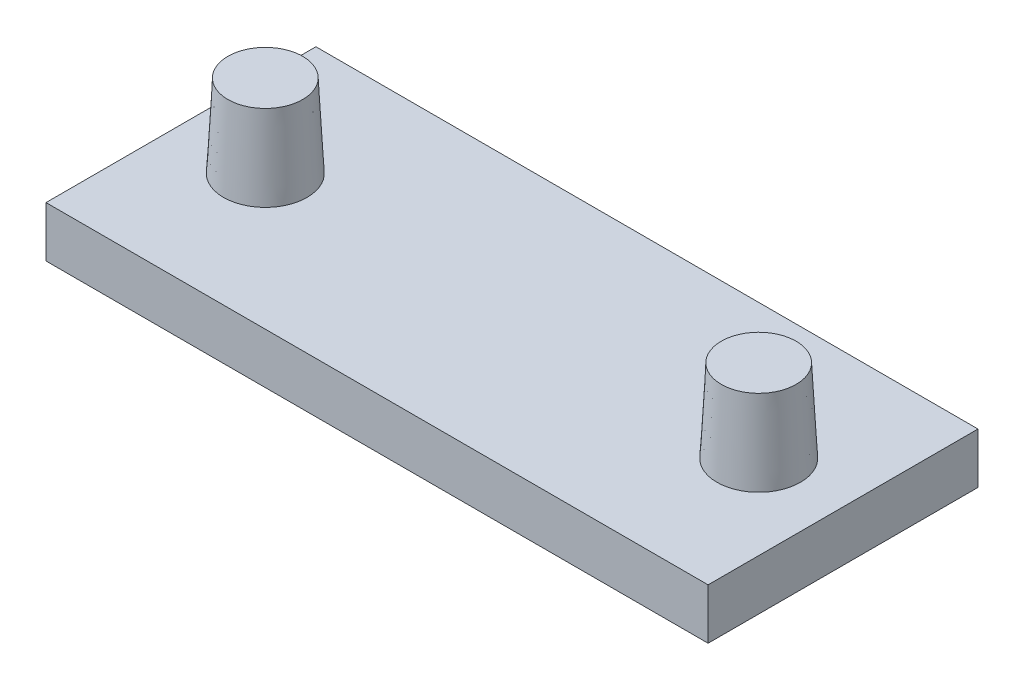
ISO-10303-21;
HEADER;
FILE_DESCRIPTION(('STEP AP214'),'2;1');
FILE_NAME('part.step','',(''),(''),'','','');
FILE_SCHEMA(('AUTOMOTIVE_DESIGN { 1 0 10303 214 1 1 1 1 }'));
ENDSEC;
DATA;
#1=APPLICATION_CONTEXT('core data for automotive mechanical design processes');
#2=APPLICATION_PROTOCOL_DEFINITION('international standard','automotive_design',2000,#1);
#3=PRODUCT_CONTEXT('',#1,'mechanical');
#4=PRODUCT('Part','Part','',(#3));
#5=PRODUCT_RELATED_PRODUCT_CATEGORY('part','',(#4));
#6=PRODUCT_DEFINITION_FORMATION('','',#4);
#7=PRODUCT_DEFINITION_CONTEXT('part definition',#1,'design');
#8=PRODUCT_DEFINITION('design','',#6,#7);
#9=PRODUCT_DEFINITION_SHAPE('','',#8);
#10=(LENGTH_UNIT() NAMED_UNIT(*) SI_UNIT(.MILLI.,.METRE.));
#11=(NAMED_UNIT(*) PLANE_ANGLE_UNIT() SI_UNIT($,.RADIAN.));
#12=(NAMED_UNIT(*) SI_UNIT($,.STERADIAN.) SOLID_ANGLE_UNIT());
#13=UNCERTAINTY_MEASURE_WITH_UNIT(LENGTH_MEASURE(1.E-05),#10,'distance_accuracy_value','');
#14=(GEOMETRIC_REPRESENTATION_CONTEXT(3) GLOBAL_UNCERTAINTY_ASSIGNED_CONTEXT((#13)) GLOBAL_UNIT_ASSIGNED_CONTEXT((#10,
#11,#12)) REPRESENTATION_CONTEXT('',''));
#15=CARTESIAN_POINT('',(0.,0.,0.));
#16=DIRECTION('',(0.,0.,1.));
#17=DIRECTION('',(1.,0.,0.));
#18=AXIS2_PLACEMENT_3D('',#15,#16,#17);
#19=CARTESIAN_POINT('',(-4.17338691038083,3.,2.89774806999235));
#20=DIRECTION('',(1.,0.,0.));
#21=DIRECTION('',(0.,0.,-1.));
#22=AXIS2_PLACEMENT_3D('',#19,#20,#21);
#23=PLANE('',#22);
#24=DIRECTION('',(0.,0.,1.));
#25=VECTOR('',#24,1.);
#26=CARTESIAN_POINT('',(-4.17338691038083,0.,2.89774806999235));
#27=LINE('',#26,#25);
#28=CARTESIAN_POINT('',(-4.17338691038083,0.,-13.1022519300077));
#29=VERTEX_POINT('',#28);
#30=CARTESIAN_POINT('',(-4.17338691038083,0.,2.89774806999235));
#31=VERTEX_POINT('',#30);
#32=EDGE_CURVE('E101',#29,#31,#27,.T.);
#33=ORIENTED_EDGE('',*,*,#32,.T.);
#34=DIRECTION('',(0.,-1.,0.));
#35=VECTOR('',#34,1.);
#36=CARTESIAN_POINT('',(-4.17338691038083,3.,2.89774806999235));
#37=LINE('',#36,#35);
#38=CARTESIAN_POINT('',(-4.17338691038083,3.,2.89774806999235));
#39=VERTEX_POINT('',#38);
#40=EDGE_CURVE('E92',#39,#31,#37,.T.);
#41=ORIENTED_EDGE('',*,*,#40,.F.);
#42=DIRECTION('',(0.,0.,1.));
#43=VECTOR('',#42,1.);
#44=CARTESIAN_POINT('',(-4.17338691038083,3.,2.89774806999235));
#45=LINE('',#44,#43);
#46=CARTESIAN_POINT('',(-4.17338691038083,3.,-13.1022519300077));
#47=VERTEX_POINT('',#46);
#48=EDGE_CURVE('E86',#47,#39,#45,.T.);
#49=ORIENTED_EDGE('',*,*,#48,.F.);
#50=DIRECTION('',(0.,-1.,0.));
#51=VECTOR('',#50,1.);
#52=CARTESIAN_POINT('',(-4.17338691038083,3.,-13.1022519300077));
#53=LINE('',#52,#51);
#54=EDGE_CURVE('E97',#47,#29,#53,.T.);
#55=ORIENTED_EDGE('',*,*,#54,.T.);
#56=EDGE_LOOP('',(#33,#41,#49,#55));
#57=FACE_BOUND('',#56,.T.);
#58=ADVANCED_FACE('F34',(#57),#23,.F.);
#59=CARTESIAN_POINT('',(-4.17338691038083,3.,2.89774806999235));
#60=DIRECTION('',(0.,0.,-1.));
#61=DIRECTION('',(-1.,0.,0.));
#62=AXIS2_PLACEMENT_3D('',#59,#60,#61);
#63=PLANE('',#62);
#64=DIRECTION('',(1.,0.,0.));
#65=VECTOR('',#64,1.);
#66=CARTESIAN_POINT('',(-4.17338691038083,0.,2.89774806999235));
#67=LINE('',#66,#65);
#68=CARTESIAN_POINT('',(35.0766130896192,0.,2.89774806999235));
#69=VERTEX_POINT('',#68);
#70=EDGE_CURVE('E91',#31,#69,#67,.T.);
#71=ORIENTED_EDGE('',*,*,#70,.T.);
#72=DIRECTION('',(0.,-1.,0.));
#73=VECTOR('',#72,1.);
#74=CARTESIAN_POINT('',(35.0766130896192,3.,2.89774806999235));
#75=LINE('',#74,#73);
#76=CARTESIAN_POINT('',(35.0766130896192,3.,2.89774806999235));
#77=VERTEX_POINT('',#76);
#78=EDGE_CURVE('E89',#77,#69,#75,.T.);
#79=ORIENTED_EDGE('',*,*,#78,.F.);
#80=DIRECTION('',(1.,0.,0.));
#81=VECTOR('',#80,1.);
#82=CARTESIAN_POINT('',(-4.17338691038083,3.,2.89774806999235));
#83=LINE('',#82,#81);
#84=EDGE_CURVE('E81',#39,#77,#83,.T.);
#85=ORIENTED_EDGE('',*,*,#84,.F.);
#86=ORIENTED_EDGE('',*,*,#40,.T.);
#87=EDGE_LOOP('',(#71,#79,#85,#86));
#88=FACE_BOUND('',#87,.T.);
#89=ADVANCED_FACE('F90',(#88),#63,.F.);
#90=CARTESIAN_POINT('',(35.0766130896192,3.,2.89774806999235));
#91=DIRECTION('',(-1.,0.,0.));
#92=DIRECTION('',(0.,0.,1.));
#93=AXIS2_PLACEMENT_3D('',#90,#91,#92);
#94=PLANE('',#93);
#95=DIRECTION('',(0.,0.,-1.));
#96=VECTOR('',#95,1.);
#97=CARTESIAN_POINT('',(35.0766130896192,0.,2.89774806999235));
#98=LINE('',#97,#96);
#99=CARTESIAN_POINT('',(35.0766130896192,0.,-13.1022519300077));
#100=VERTEX_POINT('',#99);
#101=EDGE_CURVE('E67',#69,#100,#98,.T.);
#102=ORIENTED_EDGE('',*,*,#101,.T.);
#103=DIRECTION('',(0.,-1.,0.));
#104=VECTOR('',#103,1.);
#105=CARTESIAN_POINT('',(35.0766130896192,3.,-13.1022519300077));
#106=LINE('',#105,#104);
#107=CARTESIAN_POINT('',(35.0766130896192,3.,-13.1022519300077));
#108=VERTEX_POINT('',#107);
#109=EDGE_CURVE('E93',#108,#100,#106,.T.);
#110=ORIENTED_EDGE('',*,*,#109,.F.);
#111=DIRECTION('',(0.,0.,-1.));
#112=VECTOR('',#111,1.);
#113=CARTESIAN_POINT('',(35.0766130896192,3.,2.89774806999235));
#114=LINE('',#113,#112);
#115=EDGE_CURVE('E84',#77,#108,#114,.T.);
#116=ORIENTED_EDGE('',*,*,#115,.F.);
#117=ORIENTED_EDGE('',*,*,#78,.T.);
#118=EDGE_LOOP('',(#102,#110,#116,#117));
#119=FACE_BOUND('',#118,.T.);
#120=ADVANCED_FACE('F95',(#119),#94,.F.);
#121=CARTESIAN_POINT('',(-4.17338691038083,3.,-13.1022519300077));
#122=DIRECTION('',(0.,0.,1.));
#123=DIRECTION('',(1.,0.,0.));
#124=AXIS2_PLACEMENT_3D('',#121,#122,#123);
#125=PLANE('',#124);
#126=DIRECTION('',(-1.,0.,0.));
#127=VECTOR('',#126,1.);
#128=CARTESIAN_POINT('',(-4.17338691038083,0.,-13.1022519300077));
#129=LINE('',#128,#127);
#130=EDGE_CURVE('E73',#100,#29,#129,.T.);
#131=ORIENTED_EDGE('',*,*,#130,.T.);
#132=ORIENTED_EDGE('',*,*,#54,.F.);
#133=DIRECTION('',(-1.,0.,0.));
#134=VECTOR('',#133,1.);
#135=CARTESIAN_POINT('',(-4.17338691038083,3.,-13.1022519300077));
#136=LINE('',#135,#134);
#137=EDGE_CURVE('E50',#108,#47,#136,.T.);
#138=ORIENTED_EDGE('',*,*,#137,.F.);
#139=ORIENTED_EDGE('',*,*,#109,.T.);
#140=EDGE_LOOP('',(#131,#132,#138,#139));
#141=FACE_BOUND('',#140,.T.);
#142=ADVANCED_FACE('F117',(#141),#125,.F.);
#143=CARTESIAN_POINT('',(0.,3.,0.));
#144=DIRECTION('',(0.,-1.,0.));
#145=DIRECTION('',(0.,0.,-1.));
#146=AXIS2_PLACEMENT_3D('',#143,#144,#145);
#147=PLANE('',#146);
#148=CARTESIAN_POINT('',(30.0766130896192,3.,-5.10225193000765));
#149=DIRECTION('',(0.,-1.,0.));
#150=DIRECTION('',(0.,0.,-1.));
#151=AXIS2_PLACEMENT_3D('',#148,#149,#150);
#152=CIRCLE('',#151,2.475);
#153=CARTESIAN_POINT('',(30.0766130896192,3.,-7.57725193000765));
#154=VERTEX_POINT('',#153);
#155=EDGE_CURVE('E11',#154,#154,#152,.F.);
#156=ORIENTED_EDGE('',*,*,#155,.F.);
#157=EDGE_LOOP('',(#156));
#158=FACE_BOUND('',#157,.T.);
#159=CARTESIAN_POINT('',(0.826613089619173,3.,-5.10225193000765));
#160=DIRECTION('',(0.,-1.,0.));
#161=DIRECTION('',(0.,0.,-1.));
#162=AXIS2_PLACEMENT_3D('',#159,#160,#161);
#163=CIRCLE('',#162,2.475);
#164=CARTESIAN_POINT('',(0.826613089619173,3.,-7.57725193000765));
#165=VERTEX_POINT('',#164);
#166=EDGE_CURVE('E42',#165,#165,#163,.F.);
#167=ORIENTED_EDGE('',*,*,#166,.F.);
#168=EDGE_LOOP('',(#167));
#169=FACE_BOUND('',#168,.T.);
#170=ORIENTED_EDGE('',*,*,#48,.T.);
#171=ORIENTED_EDGE('',*,*,#84,.T.);
#172=ORIENTED_EDGE('',*,*,#115,.T.);
#173=ORIENTED_EDGE('',*,*,#137,.T.);
#174=EDGE_LOOP('',(#170,#171,#172,#173));
#175=FACE_BOUND('',#174,.T.);
#176=ADVANCED_FACE('F82',(#158,#169,#175),#147,.F.);
#177=CARTESIAN_POINT('',(0.,0.,0.));
#178=DIRECTION('',(0.,-1.,0.));
#179=DIRECTION('',(0.,0.,-1.));
#180=AXIS2_PLACEMENT_3D('',#177,#178,#179);
#181=PLANE('',#180);
#182=ORIENTED_EDGE('',*,*,#32,.F.);
#183=ORIENTED_EDGE('',*,*,#130,.F.);
#184=ORIENTED_EDGE('',*,*,#101,.F.);
#185=ORIENTED_EDGE('',*,*,#70,.F.);
#186=EDGE_LOOP('',(#182,#183,#184,#185));
#187=FACE_BOUND('',#186,.T.);
#188=ADVANCED_FACE('F116',(#187),#181,.T.);
#189=CARTESIAN_POINT('',(0.826613089619173,3.,-5.10225193000765));
#190=DIRECTION('',(0.,-1.,0.));
#191=DIRECTION('',(0.,0.,1.));
#192=AXIS2_PLACEMENT_3D('',#189,#190,#191);
#193=CONICAL_SURFACE('',#192,2.475,0.0523598775598299);
#194=CARTESIAN_POINT('',(0.826613089619173,7.9,-5.10225193000765));
#195=DIRECTION('',(0.,1.,0.));
#196=DIRECTION('',(0.,0.,1.));
#197=AXIS2_PLACEMENT_3D('',#194,#195,#196);
#198=CIRCLE('',#197,2.2182018815131);
#199=CARTESIAN_POINT('',(0.826613089619173,7.9,-2.88405004849455));
#200=VERTEX_POINT('',#199);
#201=EDGE_CURVE('E104',#200,#200,#198,.T.);
#202=ORIENTED_EDGE('',*,*,#201,.F.);
#203=EDGE_LOOP('',(#202));
#204=FACE_BOUND('',#203,.T.);
#205=ORIENTED_EDGE('',*,*,#166,.T.);
#206=EDGE_LOOP('',(#205));
#207=FACE_BOUND('',#206,.T.);
#208=ADVANCED_FACE('F113',(#204,#207),#193,.T.);
#209=CARTESIAN_POINT('',(0.826613089619173,7.9,-5.10225193000765));
#210=DIRECTION('',(0.,1.,0.));
#211=DIRECTION('',(0.,0.,1.));
#212=AXIS2_PLACEMENT_3D('',#209,#210,#211);
#213=PLANE('',#212);
#214=ORIENTED_EDGE('',*,*,#201,.T.);
#215=EDGE_LOOP('',(#214));
#216=FACE_BOUND('',#215,.T.);
#217=ADVANCED_FACE('F147',(#216),#213,.T.);
#218=CARTESIAN_POINT('',(30.0766130896192,3.,-5.10225193000765));
#219=DIRECTION('',(0.,-1.,0.));
#220=DIRECTION('',(0.,0.,1.));
#221=AXIS2_PLACEMENT_3D('',#218,#219,#220);
#222=CONICAL_SURFACE('',#221,2.475,0.0523598775598299);
#223=CARTESIAN_POINT('',(30.0766130896192,7.9,-5.10225193000765));
#224=DIRECTION('',(0.,1.,0.));
#225=DIRECTION('',(0.,0.,1.));
#226=AXIS2_PLACEMENT_3D('',#223,#224,#225);
#227=CIRCLE('',#226,2.21820188151309);
#228=CARTESIAN_POINT('',(30.0766130896192,7.9,-2.88405004849456));
#229=VERTEX_POINT('',#228);
#230=EDGE_CURVE('E138',#229,#229,#227,.T.);
#231=ORIENTED_EDGE('',*,*,#230,.F.);
#232=EDGE_LOOP('',(#231));
#233=FACE_BOUND('',#232,.T.);
#234=ORIENTED_EDGE('',*,*,#155,.T.);
#235=EDGE_LOOP('',(#234));
#236=FACE_BOUND('',#235,.T.);
#237=ADVANCED_FACE('F144',(#233,#236),#222,.T.);
#238=CARTESIAN_POINT('',(30.0766130896192,7.9,-5.10225193000765));
#239=DIRECTION('',(0.,1.,0.));
#240=DIRECTION('',(0.,0.,1.));
#241=AXIS2_PLACEMENT_3D('',#238,#239,#240);
#242=PLANE('',#241);
#243=ORIENTED_EDGE('',*,*,#230,.T.);
#244=EDGE_LOOP('',(#243));
#245=FACE_BOUND('',#244,.T.);
#246=ADVANCED_FACE('F142',(#245),#242,.T.);
#247=CLOSED_SHELL('',(#58,#89,#120,#142,#176,#188,#208,#217,#237,#246));
#248=MANIFOLD_SOLID_BREP('B2',#247);
#249=ADVANCED_BREP_SHAPE_REPRESENTATION('',(#18,#248),#14);
#250=SHAPE_DEFINITION_REPRESENTATION(#9,#249);
ENDSEC;
END-ISO-10303-21;
